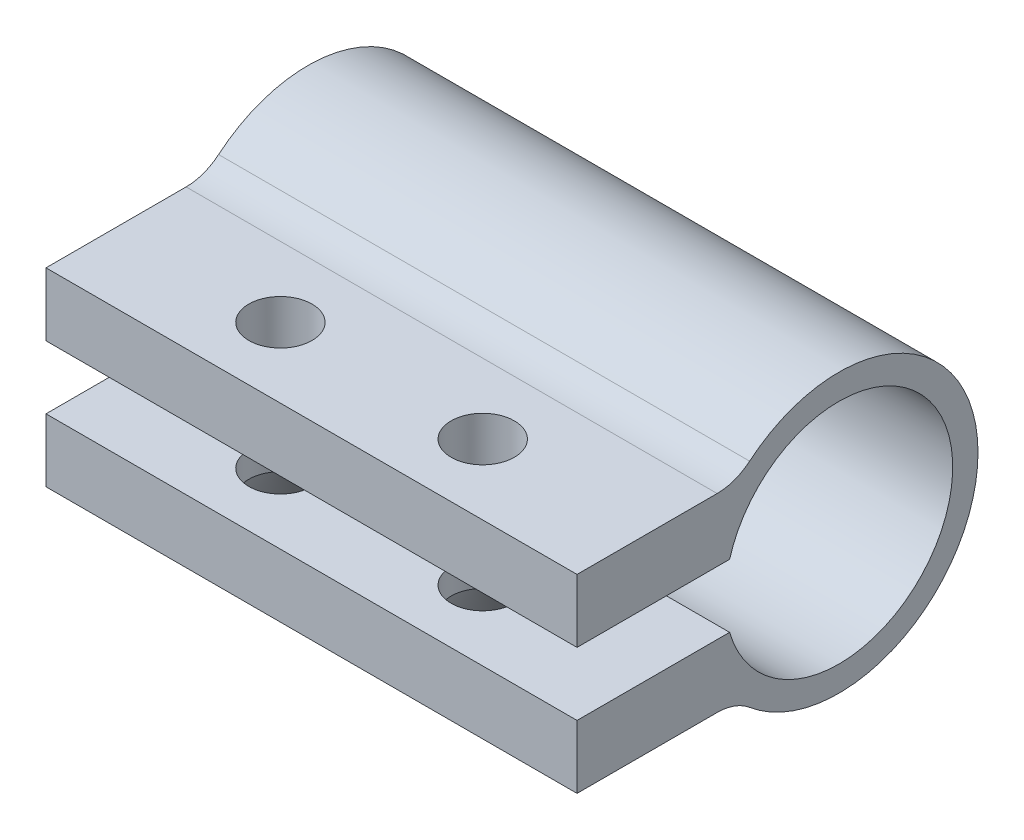
ISO-10303-21;
HEADER;
FILE_DESCRIPTION(('STEP AP214'),'2;1');
FILE_NAME('part.step','',(''),(''),'','','');
FILE_SCHEMA(('AUTOMOTIVE_DESIGN { 1 0 10303 214 1 1 1 1 }'));
ENDSEC;
DATA;
#1=APPLICATION_CONTEXT('core data for automotive mechanical design processes');
#2=APPLICATION_PROTOCOL_DEFINITION('international standard','automotive_design',2000,#1);
#3=PRODUCT_CONTEXT('',#1,'mechanical');
#4=PRODUCT('Part','Part','',(#3));
#5=PRODUCT_RELATED_PRODUCT_CATEGORY('part','',(#4));
#6=PRODUCT_DEFINITION_FORMATION('','',#4);
#7=PRODUCT_DEFINITION_CONTEXT('part definition',#1,'design');
#8=PRODUCT_DEFINITION('design','',#6,#7);
#9=PRODUCT_DEFINITION_SHAPE('','',#8);
#10=(LENGTH_UNIT() NAMED_UNIT(*) SI_UNIT(.MILLI.,.METRE.));
#11=(NAMED_UNIT(*) PLANE_ANGLE_UNIT() SI_UNIT($,.RADIAN.));
#12=(NAMED_UNIT(*) SI_UNIT($,.STERADIAN.) SOLID_ANGLE_UNIT());
#13=UNCERTAINTY_MEASURE_WITH_UNIT(LENGTH_MEASURE(1.E-05),#10,'distance_accuracy_value','');
#14=(GEOMETRIC_REPRESENTATION_CONTEXT(3) GLOBAL_UNCERTAINTY_ASSIGNED_CONTEXT((#13)) GLOBAL_UNIT_ASSIGNED_CONTEXT((#10,
#11,#12)) REPRESENTATION_CONTEXT('',''));
#15=CARTESIAN_POINT('',(0.,0.,0.));
#16=DIRECTION('',(0.,0.,1.));
#17=DIRECTION('',(1.,0.,0.));
#18=AXIS2_PLACEMENT_3D('',#15,#16,#17);
#19=CARTESIAN_POINT('',(72.,0.,25.2473413021058));
#20=DIRECTION('',(1.,0.,0.));
#21=DIRECTION('',(0.,0.,-1.));
#22=AXIS2_PLACEMENT_3D('',#19,#20,#21);
#23=PLANE('',#22);
#24=CARTESIAN_POINT('',(72.,-11.5,34.8780214442349));
#25=DIRECTION('',(1.,0.,0.));
#26=DIRECTION('',(0.,0.,-1.));
#27=AXIS2_PLACEMENT_3D('',#24,#25,#26);
#28=CIRCLE('',#27,4.);
#29=CARTESIAN_POINT('',(72.,-7.5,34.8780214442349));
#30=VERTEX_POINT('',#29);
#31=CARTESIAN_POINT('',(72.,-8.43333333333333,32.3098400730005));
#32=VERTEX_POINT('',#31);
#33=EDGE_CURVE('E11',#30,#32,#28,.F.);
#34=ORIENTED_EDGE('',*,*,#33,.T.);
#35=CARTESIAN_POINT('',(72.,0.,25.2473413021058));
#36=DIRECTION('',(1.,0.,0.));
#37=DIRECTION('',(0.,0.,-1.));
#38=AXIS2_PLACEMENT_3D('',#35,#36,#37);
#39=CIRCLE('',#38,11.);
#40=CARTESIAN_POINT('',(72.,8.43333333333333,32.3098400730005));
#41=VERTEX_POINT('',#40);
#42=EDGE_CURVE('E125',#32,#41,#39,.T.);
#43=ORIENTED_EDGE('',*,*,#42,.T.);
#44=CARTESIAN_POINT('',(72.,11.5,34.8780214442349));
#45=DIRECTION('',(1.,0.,0.));
#46=DIRECTION('',(0.,0.,-1.));
#47=AXIS2_PLACEMENT_3D('',#44,#45,#46);
#48=CIRCLE('',#47,4.);
#49=CARTESIAN_POINT('',(72.,7.5,34.8780214442349));
#50=VERTEX_POINT('',#49);
#51=EDGE_CURVE('E165',#41,#50,#48,.F.);
#52=ORIENTED_EDGE('',*,*,#51,.T.);
#53=DIRECTION('',(0.,0.,1.));
#54=VECTOR('',#53,1.);
#55=CARTESIAN_POINT('',(72.,7.5,33.2940797718214));
#56=LINE('',#55,#54);
#57=CARTESIAN_POINT('',(72.,7.5,45.9594839449201));
#58=VERTEX_POINT('',#57);
#59=EDGE_CURVE('E206',#50,#58,#56,.T.);
#60=ORIENTED_EDGE('',*,*,#59,.T.);
#61=DIRECTION('',(0.,-1.,0.));
#62=VECTOR('',#61,1.);
#63=CARTESIAN_POINT('',(72.,2.5,45.9594839449201));
#64=LINE('',#63,#62);
#65=CARTESIAN_POINT('',(72.,2.5,45.9594839449201));
#66=VERTEX_POINT('',#65);
#67=EDGE_CURVE('E209',#58,#66,#64,.T.);
#68=ORIENTED_EDGE('',*,*,#67,.T.);
#69=DIRECTION('',(0.,0.,-1.));
#70=VECTOR('',#69,1.);
#71=CARTESIAN_POINT('',(72.,2.5,33.8931495350011));
#72=LINE('',#71,#70);
#73=CARTESIAN_POINT('',(72.,2.5,33.8931495350011));
#74=VERTEX_POINT('',#73);
#75=EDGE_CURVE('E212',#66,#74,#72,.T.);
#76=ORIENTED_EDGE('',*,*,#75,.T.);
#77=CARTESIAN_POINT('',(72.,0.,25.2473413021058));
#78=DIRECTION('',(-1.,0.,0.));
#79=DIRECTION('',(0.,0.,-1.));
#80=AXIS2_PLACEMENT_3D('',#77,#78,#79);
#81=CIRCLE('',#80,9.);
#82=CARTESIAN_POINT('',(72.,-2.5,33.8931495350011));
#83=VERTEX_POINT('',#82);
#84=EDGE_CURVE('E215',#74,#83,#81,.T.);
#85=ORIENTED_EDGE('',*,*,#84,.T.);
#86=DIRECTION('',(0.,0.,1.));
#87=VECTOR('',#86,1.);
#88=CARTESIAN_POINT('',(72.,-2.5,33.8931495350011));
#89=LINE('',#88,#87);
#90=CARTESIAN_POINT('',(72.,-2.5,45.9594839449201));
#91=VERTEX_POINT('',#90);
#92=EDGE_CURVE('E130',#83,#91,#89,.T.);
#93=ORIENTED_EDGE('',*,*,#92,.T.);
#94=DIRECTION('',(0.,-1.,0.));
#95=VECTOR('',#94,1.);
#96=CARTESIAN_POINT('',(72.,-2.5,45.9594839449201));
#97=LINE('',#96,#95);
#98=CARTESIAN_POINT('',(72.,-7.5,45.9594839449201));
#99=VERTEX_POINT('',#98);
#100=EDGE_CURVE('E126',#91,#99,#97,.T.);
#101=ORIENTED_EDGE('',*,*,#100,.T.);
#102=DIRECTION('',(0.,0.,-1.));
#103=VECTOR('',#102,1.);
#104=CARTESIAN_POINT('',(72.,-7.5,33.2940797718214));
#105=LINE('',#104,#103);
#106=EDGE_CURVE('E116',#99,#30,#105,.T.);
#107=ORIENTED_EDGE('',*,*,#106,.T.);
#108=EDGE_LOOP('',(#34,#43,#52,#60,#68,#76,#85,#93,#101,#107));
#109=FACE_BOUND('',#108,.T.);
#110=ADVANCED_FACE('F39',(#109),#23,.T.);
#111=CARTESIAN_POINT('',(30.,0.,25.2473413021058));
#112=DIRECTION('',(1.,0.,0.));
#113=DIRECTION('',(0.,0.,-1.));
#114=AXIS2_PLACEMENT_3D('',#111,#112,#113);
#115=PLANE('',#114);
#116=CARTESIAN_POINT('',(30.,0.,25.2473413021058));
#117=DIRECTION('',(1.,0.,0.));
#118=DIRECTION('',(0.,0.,-1.));
#119=AXIS2_PLACEMENT_3D('',#116,#117,#118);
#120=CIRCLE('',#119,11.);
#121=CARTESIAN_POINT('',(30.,-8.43333333333333,32.3098400730005));
#122=VERTEX_POINT('',#121);
#123=CARTESIAN_POINT('',(30.,8.43333333333333,32.3098400730005));
#124=VERTEX_POINT('',#123);
#125=EDGE_CURVE('E226',#122,#124,#120,.T.);
#126=ORIENTED_EDGE('',*,*,#125,.F.);
#127=CARTESIAN_POINT('',(30.,-11.5,34.8780214442349));
#128=DIRECTION('',(1.,0.,0.));
#129=DIRECTION('',(0.,0.,-1.));
#130=AXIS2_PLACEMENT_3D('',#127,#128,#129);
#131=CIRCLE('',#130,4.);
#132=CARTESIAN_POINT('',(30.,-7.5,34.8780214442349));
#133=VERTEX_POINT('',#132);
#134=EDGE_CURVE('E49',#122,#133,#131,.T.);
#135=ORIENTED_EDGE('',*,*,#134,.T.);
#136=DIRECTION('',(0.,0.,-1.));
#137=VECTOR('',#136,1.);
#138=CARTESIAN_POINT('',(30.,-7.5,33.2940797718214));
#139=LINE('',#138,#137);
#140=CARTESIAN_POINT('',(30.,-7.5,45.9594839449201));
#141=VERTEX_POINT('',#140);
#142=EDGE_CURVE('E223',#141,#133,#139,.T.);
#143=ORIENTED_EDGE('',*,*,#142,.F.);
#144=DIRECTION('',(0.,-1.,0.));
#145=VECTOR('',#144,1.);
#146=CARTESIAN_POINT('',(30.,-2.5,45.9594839449201));
#147=LINE('',#146,#145);
#148=CARTESIAN_POINT('',(30.,-2.5,45.9594839449201));
#149=VERTEX_POINT('',#148);
#150=EDGE_CURVE('E139',#149,#141,#147,.T.);
#151=ORIENTED_EDGE('',*,*,#150,.F.);
#152=DIRECTION('',(0.,0.,1.));
#153=VECTOR('',#152,1.);
#154=CARTESIAN_POINT('',(30.,-2.5,33.8931495350011));
#155=LINE('',#154,#153);
#156=CARTESIAN_POINT('',(30.,-2.5,33.8931495350011));
#157=VERTEX_POINT('',#156);
#158=EDGE_CURVE('E135',#157,#149,#155,.T.);
#159=ORIENTED_EDGE('',*,*,#158,.F.);
#160=CARTESIAN_POINT('',(30.,0.,25.2473413021058));
#161=DIRECTION('',(-1.,0.,0.));
#162=DIRECTION('',(0.,0.,-1.));
#163=AXIS2_PLACEMENT_3D('',#160,#161,#162);
#164=CIRCLE('',#163,9.);
#165=CARTESIAN_POINT('',(30.,2.5,33.8931495350011));
#166=VERTEX_POINT('',#165);
#167=EDGE_CURVE('E239',#166,#157,#164,.T.);
#168=ORIENTED_EDGE('',*,*,#167,.F.);
#169=DIRECTION('',(0.,0.,-1.));
#170=VECTOR('',#169,1.);
#171=CARTESIAN_POINT('',(30.,2.5,33.8931495350011));
#172=LINE('',#171,#170);
#173=CARTESIAN_POINT('',(30.,2.5,45.9594839449201));
#174=VERTEX_POINT('',#173);
#175=EDGE_CURVE('E236',#174,#166,#172,.T.);
#176=ORIENTED_EDGE('',*,*,#175,.F.);
#177=DIRECTION('',(0.,-1.,0.));
#178=VECTOR('',#177,1.);
#179=CARTESIAN_POINT('',(30.,2.5,45.9594839449201));
#180=LINE('',#179,#178);
#181=CARTESIAN_POINT('',(30.,7.5,45.9594839449201));
#182=VERTEX_POINT('',#181);
#183=EDGE_CURVE('E233',#182,#174,#180,.T.);
#184=ORIENTED_EDGE('',*,*,#183,.F.);
#185=DIRECTION('',(0.,0.,1.));
#186=VECTOR('',#185,1.);
#187=CARTESIAN_POINT('',(30.,7.5,33.2940797718214));
#188=LINE('',#187,#186);
#189=CARTESIAN_POINT('',(30.,7.5,34.8780214442349));
#190=VERTEX_POINT('',#189);
#191=EDGE_CURVE('E230',#190,#182,#188,.T.);
#192=ORIENTED_EDGE('',*,*,#191,.F.);
#193=CARTESIAN_POINT('',(30.,11.5,34.8780214442349));
#194=DIRECTION('',(1.,0.,0.));
#195=DIRECTION('',(0.,0.,-1.));
#196=AXIS2_PLACEMENT_3D('',#193,#194,#195);
#197=CIRCLE('',#196,4.);
#198=EDGE_CURVE('E162',#190,#124,#197,.T.);
#199=ORIENTED_EDGE('',*,*,#198,.T.);
#200=EDGE_LOOP('',(#126,#135,#143,#151,#159,#168,#176,#184,#192,#199));
#201=FACE_BOUND('',#200,.T.);
#202=ADVANCED_FACE('F265',(#201),#115,.F.);
#203=CARTESIAN_POINT('',(72.,-2.5,45.9594839449201));
#204=DIRECTION('',(0.,0.,-1.));
#205=DIRECTION('',(-1.,0.,0.));
#206=AXIS2_PLACEMENT_3D('',#203,#204,#205);
#207=PLANE('',#206);
#208=ORIENTED_EDGE('',*,*,#150,.T.);
#209=DIRECTION('',(-1.,0.,0.));
#210=VECTOR('',#209,1.);
#211=CARTESIAN_POINT('',(72.,-7.5,45.9594839449201));
#212=LINE('',#211,#210);
#213=EDGE_CURVE('E120',#99,#141,#212,.T.);
#214=ORIENTED_EDGE('',*,*,#213,.F.);
#215=ORIENTED_EDGE('',*,*,#100,.F.);
#216=DIRECTION('',(-1.,0.,0.));
#217=VECTOR('',#216,1.);
#218=CARTESIAN_POINT('',(72.,-2.5,45.9594839449201));
#219=LINE('',#218,#217);
#220=EDGE_CURVE('E220',#91,#149,#219,.T.);
#221=ORIENTED_EDGE('',*,*,#220,.T.);
#222=EDGE_LOOP('',(#208,#214,#215,#221));
#223=FACE_BOUND('',#222,.T.);
#224=ADVANCED_FACE('F137',(#223),#207,.F.);
#225=CARTESIAN_POINT('',(72.,-7.5,33.2940797718214));
#226=DIRECTION('',(0.,1.,0.));
#227=DIRECTION('',(0.,0.,1.));
#228=AXIS2_PLACEMENT_3D('',#225,#226,#227);
#229=PLANE('',#228);
#230=CARTESIAN_POINT('',(43.,-7.5,40.4187526945775));
#231=DIRECTION('',(0.,1.,0.));
#232=DIRECTION('',(0.,0.,-1.));
#233=AXIS2_PLACEMENT_3D('',#230,#231,#232);
#234=CIRCLE('',#233,4.5);
#235=CARTESIAN_POINT('',(43.,-7.5,35.9187526945775));
#236=VERTEX_POINT('',#235);
#237=EDGE_CURVE('E188',#236,#236,#234,.T.);
#238=ORIENTED_EDGE('',*,*,#237,.T.);
#239=EDGE_LOOP('',(#238));
#240=FACE_BOUND('',#239,.T.);
#241=CARTESIAN_POINT('',(59.,-7.5,40.4187526945775));
#242=DIRECTION('',(0.,-1.,0.));
#243=DIRECTION('',(0.,0.,-1.));
#244=AXIS2_PLACEMENT_3D('',#241,#242,#243);
#245=CIRCLE('',#244,4.5);
#246=CARTESIAN_POINT('',(59.,-7.5,35.9187526945775));
#247=VERTEX_POINT('',#246);
#248=EDGE_CURVE('E173',#247,#247,#245,.T.);
#249=ORIENTED_EDGE('',*,*,#248,.F.);
#250=EDGE_LOOP('',(#249));
#251=FACE_BOUND('',#250,.T.);
#252=ORIENTED_EDGE('',*,*,#142,.T.);
#253=DIRECTION('',(1.,0.,0.));
#254=VECTOR('',#253,1.);
#255=CARTESIAN_POINT('',(72.,-7.5,34.8780214442349));
#256=LINE('',#255,#254);
#257=EDGE_CURVE('E57',#133,#30,#256,.T.);
#258=ORIENTED_EDGE('',*,*,#257,.T.);
#259=ORIENTED_EDGE('',*,*,#106,.F.);
#260=ORIENTED_EDGE('',*,*,#213,.T.);
#261=EDGE_LOOP('',(#252,#258,#259,#260));
#262=FACE_BOUND('',#261,.T.);
#263=ADVANCED_FACE('F118',(#240,#251,#262),#229,.F.);
#264=CARTESIAN_POINT('',(72.,0.,25.2473413021058));
#265=DIRECTION('',(-1.,0.,0.));
#266=DIRECTION('',(0.,0.,1.));
#267=AXIS2_PLACEMENT_3D('',#264,#265,#266);
#268=CYLINDRICAL_SURFACE('',#267,11.);
#269=ORIENTED_EDGE('',*,*,#125,.T.);
#270=DIRECTION('',(-1.,0.,0.));
#271=VECTOR('',#270,1.);
#272=CARTESIAN_POINT('',(72.,8.43333333333333,32.3098400730005));
#273=LINE('',#272,#271);
#274=EDGE_CURVE('E147',#124,#41,#273,.F.);
#275=ORIENTED_EDGE('',*,*,#274,.T.);
#276=ORIENTED_EDGE('',*,*,#42,.F.);
#277=DIRECTION('',(-1.,0.,0.));
#278=VECTOR('',#277,1.);
#279=CARTESIAN_POINT('',(72.,-8.43333333333333,32.3098400730005));
#280=LINE('',#279,#278);
#281=EDGE_CURVE('E156',#32,#122,#280,.T.);
#282=ORIENTED_EDGE('',*,*,#281,.T.);
#283=EDGE_LOOP('',(#269,#275,#276,#282));
#284=FACE_BOUND('',#283,.T.);
#285=ADVANCED_FACE('F286',(#284),#268,.T.);
#286=CARTESIAN_POINT('',(72.,7.5,33.2940797718214));
#287=DIRECTION('',(0.,-1.,0.));
#288=DIRECTION('',(0.,0.,-1.));
#289=AXIS2_PLACEMENT_3D('',#286,#287,#288);
#290=PLANE('',#289);
#291=CARTESIAN_POINT('',(59.,7.5,40.4187526945775));
#292=DIRECTION('',(0.,-1.,0.));
#293=DIRECTION('',(0.,0.,-1.));
#294=AXIS2_PLACEMENT_3D('',#291,#292,#293);
#295=CIRCLE('',#294,2.5);
#296=CARTESIAN_POINT('',(59.,7.5,37.9187526945775));
#297=VERTEX_POINT('',#296);
#298=EDGE_CURVE('E199',#297,#297,#295,.T.);
#299=ORIENTED_EDGE('',*,*,#298,.T.);
#300=EDGE_LOOP('',(#299));
#301=FACE_BOUND('',#300,.T.);
#302=CARTESIAN_POINT('',(43.,7.5,40.4187526945775));
#303=DIRECTION('',(0.,-1.,0.));
#304=DIRECTION('',(0.,0.,-1.));
#305=AXIS2_PLACEMENT_3D('',#302,#303,#304);
#306=CIRCLE('',#305,2.5);
#307=CARTESIAN_POINT('',(43.,7.5,37.9187526945775));
#308=VERTEX_POINT('',#307);
#309=EDGE_CURVE('E179',#308,#308,#306,.T.);
#310=ORIENTED_EDGE('',*,*,#309,.T.);
#311=EDGE_LOOP('',(#310));
#312=FACE_BOUND('',#311,.T.);
#313=ORIENTED_EDGE('',*,*,#59,.F.);
#314=DIRECTION('',(1.,0.,0.));
#315=VECTOR('',#314,1.);
#316=CARTESIAN_POINT('',(30.,7.5,34.8780214442349));
#317=LINE('',#316,#315);
#318=EDGE_CURVE('E141',#50,#190,#317,.F.);
#319=ORIENTED_EDGE('',*,*,#318,.T.);
#320=ORIENTED_EDGE('',*,*,#191,.T.);
#321=DIRECTION('',(-1.,0.,0.));
#322=VECTOR('',#321,1.);
#323=CARTESIAN_POINT('',(72.,7.5,45.9594839449201));
#324=LINE('',#323,#322);
#325=EDGE_CURVE('E142',#58,#182,#324,.T.);
#326=ORIENTED_EDGE('',*,*,#325,.F.);
#327=EDGE_LOOP('',(#313,#319,#320,#326));
#328=FACE_BOUND('',#327,.T.);
#329=ADVANCED_FACE('F284',(#301,#312,#328),#290,.F.);
#330=CARTESIAN_POINT('',(72.,2.5,45.9594839449201));
#331=DIRECTION('',(0.,0.,-1.));
#332=DIRECTION('',(-1.,0.,0.));
#333=AXIS2_PLACEMENT_3D('',#330,#331,#332);
#334=PLANE('',#333);
#335=ORIENTED_EDGE('',*,*,#183,.T.);
#336=DIRECTION('',(-1.,0.,0.));
#337=VECTOR('',#336,1.);
#338=CARTESIAN_POINT('',(72.,2.5,45.9594839449201));
#339=LINE('',#338,#337);
#340=EDGE_CURVE('E150',#66,#174,#339,.T.);
#341=ORIENTED_EDGE('',*,*,#340,.F.);
#342=ORIENTED_EDGE('',*,*,#67,.F.);
#343=ORIENTED_EDGE('',*,*,#325,.T.);
#344=EDGE_LOOP('',(#335,#341,#342,#343));
#345=FACE_BOUND('',#344,.T.);
#346=ADVANCED_FACE('F293',(#345),#334,.F.);
#347=CARTESIAN_POINT('',(72.,2.5,33.8931495350011));
#348=DIRECTION('',(0.,1.,0.));
#349=DIRECTION('',(0.,0.,1.));
#350=AXIS2_PLACEMENT_3D('',#347,#348,#349);
#351=PLANE('',#350);
#352=CARTESIAN_POINT('',(59.,2.5,40.4187526945775));
#353=DIRECTION('',(0.,1.,0.));
#354=DIRECTION('',(0.,0.,1.));
#355=AXIS2_PLACEMENT_3D('',#352,#353,#354);
#356=CIRCLE('',#355,2.5);
#357=CARTESIAN_POINT('',(59.,2.5,42.9187526945775));
#358=VERTEX_POINT('',#357);
#359=EDGE_CURVE('E195',#358,#358,#356,.T.);
#360=ORIENTED_EDGE('',*,*,#359,.T.);
#361=EDGE_LOOP('',(#360));
#362=FACE_BOUND('',#361,.T.);
#363=CARTESIAN_POINT('',(43.,2.5,40.4187526945775));
#364=DIRECTION('',(0.,1.,0.));
#365=DIRECTION('',(0.,0.,1.));
#366=AXIS2_PLACEMENT_3D('',#363,#364,#365);
#367=CIRCLE('',#366,2.5);
#368=CARTESIAN_POINT('',(43.,2.5,42.9187526945775));
#369=VERTEX_POINT('',#368);
#370=EDGE_CURVE('E172',#369,#369,#367,.T.);
#371=ORIENTED_EDGE('',*,*,#370,.T.);
#372=EDGE_LOOP('',(#371));
#373=FACE_BOUND('',#372,.T.);
#374=ORIENTED_EDGE('',*,*,#175,.T.);
#375=DIRECTION('',(-1.,0.,0.));
#376=VECTOR('',#375,1.);
#377=CARTESIAN_POINT('',(72.,2.5,33.8931495350011));
#378=LINE('',#377,#376);
#379=EDGE_CURVE('E250',#74,#166,#378,.T.);
#380=ORIENTED_EDGE('',*,*,#379,.F.);
#381=ORIENTED_EDGE('',*,*,#75,.F.);
#382=ORIENTED_EDGE('',*,*,#340,.T.);
#383=EDGE_LOOP('',(#374,#380,#381,#382));
#384=FACE_BOUND('',#383,.T.);
#385=ADVANCED_FACE('F259',(#362,#373,#384),#351,.F.);
#386=CARTESIAN_POINT('',(72.,0.,25.2473413021058));
#387=DIRECTION('',(-1.,0.,0.));
#388=DIRECTION('',(0.,0.,1.));
#389=AXIS2_PLACEMENT_3D('',#386,#387,#388);
#390=CYLINDRICAL_SURFACE('',#389,9.);
#391=ORIENTED_EDGE('',*,*,#167,.T.);
#392=DIRECTION('',(-1.,0.,0.));
#393=VECTOR('',#392,1.);
#394=CARTESIAN_POINT('',(72.,-2.5,33.8931495350011));
#395=LINE('',#394,#393);
#396=EDGE_CURVE('E246',#83,#157,#395,.T.);
#397=ORIENTED_EDGE('',*,*,#396,.F.);
#398=ORIENTED_EDGE('',*,*,#84,.F.);
#399=ORIENTED_EDGE('',*,*,#379,.T.);
#400=EDGE_LOOP('',(#391,#397,#398,#399));
#401=FACE_BOUND('',#400,.T.);
#402=ADVANCED_FACE('F270',(#401),#390,.F.);
#403=CARTESIAN_POINT('',(72.,-2.5,33.8931495350011));
#404=DIRECTION('',(0.,-1.,0.));
#405=DIRECTION('',(0.,0.,-1.));
#406=AXIS2_PLACEMENT_3D('',#403,#404,#405);
#407=PLANE('',#406);
#408=CARTESIAN_POINT('',(59.,-2.5,40.4187526945775));
#409=DIRECTION('',(0.,-1.,0.));
#410=DIRECTION('',(0.,0.,-1.));
#411=AXIS2_PLACEMENT_3D('',#408,#409,#410);
#412=CIRCLE('',#411,2.5);
#413=CARTESIAN_POINT('',(59.,-2.5,37.9187526945775));
#414=VERTEX_POINT('',#413);
#415=EDGE_CURVE('E43',#414,#414,#412,.T.);
#416=ORIENTED_EDGE('',*,*,#415,.T.);
#417=EDGE_LOOP('',(#416));
#418=FACE_BOUND('',#417,.T.);
#419=CARTESIAN_POINT('',(43.,-2.5,40.4187526945775));
#420=DIRECTION('',(0.,-1.,0.));
#421=DIRECTION('',(0.,0.,-1.));
#422=AXIS2_PLACEMENT_3D('',#419,#420,#421);
#423=CIRCLE('',#422,2.5);
#424=CARTESIAN_POINT('',(43.,-2.5,37.9187526945775));
#425=VERTEX_POINT('',#424);
#426=EDGE_CURVE('E169',#425,#425,#423,.T.);
#427=ORIENTED_EDGE('',*,*,#426,.T.);
#428=EDGE_LOOP('',(#427));
#429=FACE_BOUND('',#428,.T.);
#430=ORIENTED_EDGE('',*,*,#158,.T.);
#431=ORIENTED_EDGE('',*,*,#220,.F.);
#432=ORIENTED_EDGE('',*,*,#92,.F.);
#433=ORIENTED_EDGE('',*,*,#396,.T.);
#434=EDGE_LOOP('',(#430,#431,#432,#433));
#435=FACE_BOUND('',#434,.T.);
#436=ADVANCED_FACE('F273',(#418,#429,#435),#407,.F.);
#437=CARTESIAN_POINT('',(72.,11.5,34.8780214442349));
#438=DIRECTION('',(-1.,0.,0.));
#439=DIRECTION('',(0.,0.,1.));
#440=AXIS2_PLACEMENT_3D('',#437,#438,#439);
#441=CYLINDRICAL_SURFACE('',#440,4.);
#442=ORIENTED_EDGE('',*,*,#51,.F.);
#443=ORIENTED_EDGE('',*,*,#274,.F.);
#444=ORIENTED_EDGE('',*,*,#198,.F.);
#445=ORIENTED_EDGE('',*,*,#318,.F.);
#446=EDGE_LOOP('',(#442,#443,#444,#445));
#447=FACE_BOUND('',#446,.T.);
#448=ADVANCED_FACE('F282',(#447),#441,.F.);
#449=CARTESIAN_POINT('',(72.,-11.5,34.8780214442349));
#450=DIRECTION('',(-1.,0.,0.));
#451=DIRECTION('',(0.,0.,1.));
#452=AXIS2_PLACEMENT_3D('',#449,#450,#451);
#453=CYLINDRICAL_SURFACE('',#452,4.);
#454=ORIENTED_EDGE('',*,*,#33,.F.);
#455=ORIENTED_EDGE('',*,*,#257,.F.);
#456=ORIENTED_EDGE('',*,*,#134,.F.);
#457=ORIENTED_EDGE('',*,*,#281,.F.);
#458=EDGE_LOOP('',(#454,#455,#456,#457));
#459=FACE_BOUND('',#458,.T.);
#460=ADVANCED_FACE('F41',(#459),#453,.F.);
#461=CARTESIAN_POINT('',(43.,11.5090976832754,40.4187526945775));
#462=DIRECTION('',(0.,-1.,0.));
#463=DIRECTION('',(0.,0.,-1.));
#464=AXIS2_PLACEMENT_3D('',#461,#462,#463);
#465=CYLINDRICAL_SURFACE('',#464,2.5);
#466=CARTESIAN_POINT('',(43.,-4.5,40.4187526945775));
#467=DIRECTION('',(0.,1.,0.));
#468=DIRECTION('',(0.,0.,-1.));
#469=AXIS2_PLACEMENT_3D('',#466,#467,#468);
#470=CIRCLE('',#469,2.5);
#471=CARTESIAN_POINT('',(43.,-4.5,37.9187526945775));
#472=VERTEX_POINT('',#471);
#473=EDGE_CURVE('E459',#472,#472,#470,.T.);
#474=ORIENTED_EDGE('',*,*,#473,.F.);
#475=EDGE_LOOP('',(#474));
#476=FACE_BOUND('',#475,.T.);
#477=ORIENTED_EDGE('',*,*,#426,.F.);
#478=EDGE_LOOP('',(#477));
#479=FACE_BOUND('',#478,.T.);
#480=ADVANCED_FACE('F346',(#476,#479),#465,.F.);
#481=CARTESIAN_POINT('',(59.,11.5090976832754,40.4187526945775));
#482=DIRECTION('',(0.,-1.,0.));
#483=DIRECTION('',(0.,0.,-1.));
#484=AXIS2_PLACEMENT_3D('',#481,#482,#483);
#485=CYLINDRICAL_SURFACE('',#484,2.5);
#486=CARTESIAN_POINT('',(59.,-4.5,40.4187526945775));
#487=DIRECTION('',(0.,-1.,0.));
#488=DIRECTION('',(0.,0.,-1.));
#489=AXIS2_PLACEMENT_3D('',#486,#487,#488);
#490=CIRCLE('',#489,2.5);
#491=CARTESIAN_POINT('',(59.,-4.5,37.9187526945775));
#492=VERTEX_POINT('',#491);
#493=EDGE_CURVE('E182',#492,#492,#490,.T.);
#494=ORIENTED_EDGE('',*,*,#493,.T.);
#495=EDGE_LOOP('',(#494));
#496=FACE_BOUND('',#495,.T.);
#497=ORIENTED_EDGE('',*,*,#415,.F.);
#498=EDGE_LOOP('',(#497));
#499=FACE_BOUND('',#498,.T.);
#500=ADVANCED_FACE('F352',(#496,#499),#485,.F.);
#501=ORIENTED_EDGE('',*,*,#370,.F.);
#502=EDGE_LOOP('',(#501));
#503=FACE_BOUND('',#502,.T.);
#504=ORIENTED_EDGE('',*,*,#309,.F.);
#505=EDGE_LOOP('',(#504));
#506=FACE_BOUND('',#505,.T.);
#507=ADVANCED_FACE('F305',(#503,#506),#465,.F.);
#508=ORIENTED_EDGE('',*,*,#359,.F.);
#509=EDGE_LOOP('',(#508));
#510=FACE_BOUND('',#509,.T.);
#511=ORIENTED_EDGE('',*,*,#298,.F.);
#512=EDGE_LOOP('',(#511));
#513=FACE_BOUND('',#512,.T.);
#514=ADVANCED_FACE('F362',(#510,#513),#485,.F.);
#515=CARTESIAN_POINT('',(59.,-7.5,40.4187526945775));
#516=DIRECTION('',(0.,-1.,0.));
#517=DIRECTION('',(0.,0.,-1.));
#518=AXIS2_PLACEMENT_3D('',#515,#516,#517);
#519=CONICAL_SURFACE('',#518,4.5,0.588002603547567);
#520=ORIENTED_EDGE('',*,*,#493,.F.);
#521=EDGE_LOOP('',(#520));
#522=FACE_BOUND('',#521,.T.);
#523=ORIENTED_EDGE('',*,*,#248,.T.);
#524=EDGE_LOOP('',(#523));
#525=FACE_BOUND('',#524,.T.);
#526=ADVANCED_FACE('F374',(#522,#525),#519,.F.);
#527=CARTESIAN_POINT('',(43.,-7.5,40.4187526945775));
#528=DIRECTION('',(0.,-1.,0.));
#529=DIRECTION('',(0.,0.,-1.));
#530=AXIS2_PLACEMENT_3D('',#527,#528,#529);
#531=CONICAL_SURFACE('',#530,4.5,0.588002603547567);
#532=ORIENTED_EDGE('',*,*,#473,.T.);
#533=EDGE_LOOP('',(#532));
#534=FACE_BOUND('',#533,.T.);
#535=ORIENTED_EDGE('',*,*,#237,.F.);
#536=EDGE_LOOP('',(#535));
#537=FACE_BOUND('',#536,.T.);
#538=ADVANCED_FACE('F380',(#534,#537),#531,.F.);
#539=CLOSED_SHELL('',(#110,#202,#224,#263,#285,#329,#346,#385,#402,#436,#448,#460,#480,#500,
#507,#514,#526,#538));
#540=MANIFOLD_SOLID_BREP('B2',#539);
#541=ADVANCED_BREP_SHAPE_REPRESENTATION('',(#18,#540),#14);
#542=SHAPE_DEFINITION_REPRESENTATION(#9,#541);
ENDSEC;
END-ISO-10303-21;
